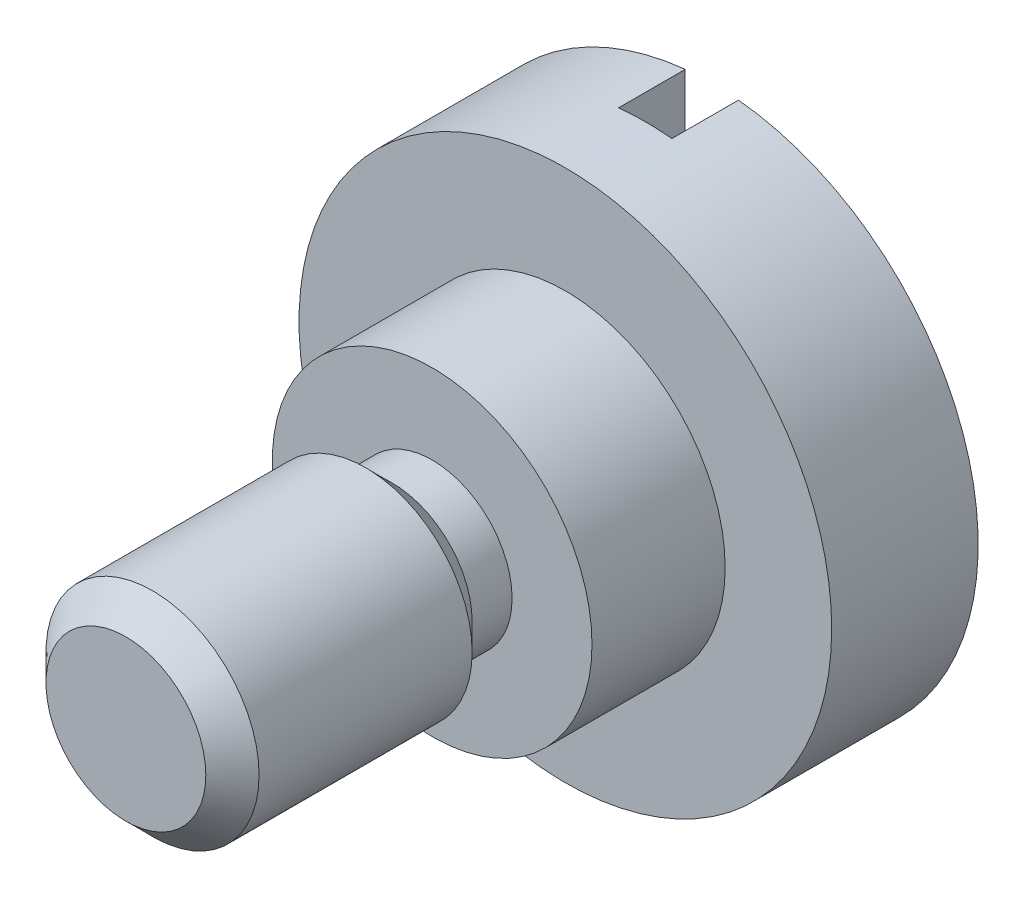
ISO-10303-21;
HEADER;
FILE_DESCRIPTION(('STEP AP214'),'2;1');
FILE_NAME('part.step','',(''),(''),'','','');
FILE_SCHEMA(('AUTOMOTIVE_DESIGN { 1 0 10303 214 1 1 1 1 }'));
ENDSEC;
DATA;
#1=APPLICATION_CONTEXT('core data for automotive mechanical design processes');
#2=APPLICATION_PROTOCOL_DEFINITION('international standard','automotive_design',2000,#1);
#3=PRODUCT_CONTEXT('',#1,'mechanical');
#4=PRODUCT('Part','Part','',(#3));
#5=PRODUCT_RELATED_PRODUCT_CATEGORY('part','',(#4));
#6=PRODUCT_DEFINITION_FORMATION('','',#4);
#7=PRODUCT_DEFINITION_CONTEXT('part definition',#1,'design');
#8=PRODUCT_DEFINITION('design','',#6,#7);
#9=PRODUCT_DEFINITION_SHAPE('','',#8);
#10=(LENGTH_UNIT() NAMED_UNIT(*) SI_UNIT(.MILLI.,.METRE.));
#11=(NAMED_UNIT(*) PLANE_ANGLE_UNIT() SI_UNIT($,.RADIAN.));
#12=(NAMED_UNIT(*) SI_UNIT($,.STERADIAN.) SOLID_ANGLE_UNIT());
#13=UNCERTAINTY_MEASURE_WITH_UNIT(LENGTH_MEASURE(1.E-05),#10,'distance_accuracy_value','');
#14=(GEOMETRIC_REPRESENTATION_CONTEXT(3) GLOBAL_UNCERTAINTY_ASSIGNED_CONTEXT((#13)) GLOBAL_UNIT_ASSIGNED_CONTEXT((#10,
#11,#12)) REPRESENTATION_CONTEXT('',''));
#15=CARTESIAN_POINT('',(0.,0.,0.));
#16=DIRECTION('',(0.,0.,1.));
#17=DIRECTION('',(1.,0.,0.));
#18=AXIS2_PLACEMENT_3D('',#15,#16,#17);
#19=CARTESIAN_POINT('',(0.,0.,0.));
#20=DIRECTION('',(0.,0.,1.));
#21=DIRECTION('',(1.,0.,0.));
#22=AXIS2_PLACEMENT_3D('',#19,#20,#21);
#23=PLANE('',#22);
#24=DIRECTION('',(0.,1.,0.));
#25=VECTOR('',#24,1.);
#26=CARTESIAN_POINT('',(-1.,0.,0.));
#27=LINE('',#26,#25);
#28=CARTESIAN_POINT('',(-1.,-9.9498743710662,0.));
#29=VERTEX_POINT('',#28);
#30=CARTESIAN_POINT('',(-1.,9.9498743710662,0.));
#31=VERTEX_POINT('',#30);
#32=EDGE_CURVE('E81',#29,#31,#27,.T.);
#33=ORIENTED_EDGE('',*,*,#32,.F.);
#34=CARTESIAN_POINT('',(0.,0.,0.));
#35=DIRECTION('',(0.,0.,1.));
#36=DIRECTION('',(1.,0.,0.));
#37=AXIS2_PLACEMENT_3D('',#34,#35,#36);
#38=CIRCLE('',#37,10.);
#39=EDGE_CURVE('E95',#31,#29,#38,.T.);
#40=ORIENTED_EDGE('',*,*,#39,.F.);
#41=EDGE_LOOP('',(#33,#40));
#42=FACE_BOUND('',#41,.T.);
#43=ADVANCED_FACE('F42',(#42),#23,.F.);
#44=CARTESIAN_POINT('',(0.,0.,5.5));
#45=DIRECTION('',(0.,0.,-1.));
#46=DIRECTION('',(-1.,0.,0.));
#47=AXIS2_PLACEMENT_3D('',#44,#45,#46);
#48=CYLINDRICAL_SURFACE('',#47,10.);
#49=CARTESIAN_POINT('',(1.,-9.9498743710662,0.));
#50=VERTEX_POINT('',#49);
#51=CARTESIAN_POINT('',(1.,9.9498743710662,0.));
#52=VERTEX_POINT('',#51);
#53=EDGE_CURVE('E100',#50,#52,#38,.T.);
#54=ORIENTED_EDGE('',*,*,#53,.T.);
#55=DIRECTION('',(0.,0.,-1.));
#56=VECTOR('',#55,1.);
#57=CARTESIAN_POINT('',(1.,9.9498743710662,5.5));
#58=LINE('',#57,#56);
#59=CARTESIAN_POINT('',(1.,9.9498743710662,2.5));
#60=VERTEX_POINT('',#59);
#61=EDGE_CURVE('E125',#52,#60,#58,.F.);
#62=ORIENTED_EDGE('',*,*,#61,.T.);
#63=CARTESIAN_POINT('',(0.,0.,2.5));
#64=DIRECTION('',(0.,0.,-1.));
#65=DIRECTION('',(-1.,0.,0.));
#66=AXIS2_PLACEMENT_3D('',#63,#64,#65);
#67=CIRCLE('',#66,10.);
#68=CARTESIAN_POINT('',(-1.,9.9498743710662,2.5));
#69=VERTEX_POINT('',#68);
#70=EDGE_CURVE('E12',#69,#60,#67,.T.);
#71=ORIENTED_EDGE('',*,*,#70,.F.);
#72=DIRECTION('',(0.,0.,-1.));
#73=VECTOR('',#72,1.);
#74=CARTESIAN_POINT('',(-1.,9.9498743710662,5.5));
#75=LINE('',#74,#73);
#76=EDGE_CURVE('E84',#31,#69,#75,.F.);
#77=ORIENTED_EDGE('',*,*,#76,.F.);
#78=ORIENTED_EDGE('',*,*,#39,.T.);
#79=DIRECTION('',(0.,0.,-1.));
#80=VECTOR('',#79,1.);
#81=CARTESIAN_POINT('',(-1.,-9.9498743710662,5.5));
#82=LINE('',#81,#80);
#83=CARTESIAN_POINT('',(-1.,-9.9498743710662,2.5));
#84=VERTEX_POINT('',#83);
#85=EDGE_CURVE('E58',#84,#29,#82,.T.);
#86=ORIENTED_EDGE('',*,*,#85,.F.);
#87=CARTESIAN_POINT('',(1.,-9.9498743710662,2.5));
#88=VERTEX_POINT('',#87);
#89=EDGE_CURVE('E47',#88,#84,#67,.T.);
#90=ORIENTED_EDGE('',*,*,#89,.F.);
#91=DIRECTION('',(0.,0.,-1.));
#92=VECTOR('',#91,1.);
#93=CARTESIAN_POINT('',(1.,-9.9498743710662,5.5));
#94=LINE('',#93,#92);
#95=EDGE_CURVE('E127',#88,#50,#94,.T.);
#96=ORIENTED_EDGE('',*,*,#95,.T.);
#97=EDGE_LOOP('',(#54,#62,#71,#77,#78,#86,#90,#96));
#98=FACE_BOUND('',#97,.T.);
#99=CARTESIAN_POINT('',(0.,0.,5.5));
#100=DIRECTION('',(0.,0.,1.));
#101=DIRECTION('',(1.,0.,0.));
#102=AXIS2_PLACEMENT_3D('',#99,#100,#101);
#103=CIRCLE('',#102,10.);
#104=CARTESIAN_POINT('',(10.,0.,5.5));
#105=VERTEX_POINT('',#104);
#106=EDGE_CURVE('E99',#105,#105,#103,.T.);
#107=ORIENTED_EDGE('',*,*,#106,.F.);
#108=EDGE_LOOP('',(#107));
#109=FACE_BOUND('',#108,.T.);
#110=ADVANCED_FACE('F93',(#98,#109),#48,.T.);
#111=CARTESIAN_POINT('',(0.,0.,5.5));
#112=DIRECTION('',(0.,0.,1.));
#113=DIRECTION('',(1.,0.,0.));
#114=AXIS2_PLACEMENT_3D('',#111,#112,#113);
#115=PLANE('',#114);
#116=CARTESIAN_POINT('',(0.,0.,5.5));
#117=DIRECTION('',(0.,0.,1.));
#118=DIRECTION('',(1.,0.,0.));
#119=AXIS2_PLACEMENT_3D('',#116,#117,#118);
#120=CIRCLE('',#119,6.);
#121=CARTESIAN_POINT('',(6.,0.,5.5));
#122=VERTEX_POINT('',#121);
#123=EDGE_CURVE('E103',#122,#122,#120,.T.);
#124=ORIENTED_EDGE('',*,*,#123,.F.);
#125=EDGE_LOOP('',(#124));
#126=FACE_BOUND('',#125,.T.);
#127=ORIENTED_EDGE('',*,*,#106,.T.);
#128=EDGE_LOOP('',(#127));
#129=FACE_BOUND('',#128,.T.);
#130=ADVANCED_FACE('F142',(#126,#129),#115,.T.);
#131=ORIENTED_EDGE('',*,*,#53,.F.);
#132=DIRECTION('',(0.,1.,0.));
#133=VECTOR('',#132,1.);
#134=CARTESIAN_POINT('',(1.,0.,0.));
#135=LINE('',#134,#133);
#136=EDGE_CURVE('E89',#50,#52,#135,.T.);
#137=ORIENTED_EDGE('',*,*,#136,.T.);
#138=EDGE_LOOP('',(#131,#137));
#139=FACE_BOUND('',#138,.T.);
#140=ADVANCED_FACE('F145',(#139),#23,.F.);
#141=CARTESIAN_POINT('',(0.,0.,10.5));
#142=DIRECTION('',(0.,0.,-1.));
#143=DIRECTION('',(-1.,0.,0.));
#144=AXIS2_PLACEMENT_3D('',#141,#142,#143);
#145=CYLINDRICAL_SURFACE('',#144,6.);
#146=CARTESIAN_POINT('',(0.,0.,10.5));
#147=DIRECTION('',(0.,0.,1.));
#148=DIRECTION('',(1.,0.,0.));
#149=AXIS2_PLACEMENT_3D('',#146,#147,#148);
#150=CIRCLE('',#149,6.);
#151=CARTESIAN_POINT('',(6.,0.,10.5));
#152=VERTEX_POINT('',#151);
#153=EDGE_CURVE('E105',#152,#152,#150,.T.);
#154=ORIENTED_EDGE('',*,*,#153,.F.);
#155=EDGE_LOOP('',(#154));
#156=FACE_BOUND('',#155,.T.);
#157=ORIENTED_EDGE('',*,*,#123,.T.);
#158=EDGE_LOOP('',(#157));
#159=FACE_BOUND('',#158,.T.);
#160=ADVANCED_FACE('F140',(#156,#159),#145,.T.);
#161=CARTESIAN_POINT('',(0.,0.,10.5));
#162=DIRECTION('',(0.,0.,1.));
#163=DIRECTION('',(1.,0.,0.));
#164=AXIS2_PLACEMENT_3D('',#161,#162,#163);
#165=PLANE('',#164);
#166=CARTESIAN_POINT('',(0.,0.,10.5));
#167=DIRECTION('',(0.,0.,1.));
#168=DIRECTION('',(1.,0.,0.));
#169=AXIS2_PLACEMENT_3D('',#166,#167,#168);
#170=CIRCLE('',#169,3.);
#171=CARTESIAN_POINT('',(3.,0.,10.5));
#172=VERTEX_POINT('',#171);
#173=EDGE_CURVE('E112',#172,#172,#170,.T.);
#174=ORIENTED_EDGE('',*,*,#173,.F.);
#175=EDGE_LOOP('',(#174));
#176=FACE_BOUND('',#175,.T.);
#177=ORIENTED_EDGE('',*,*,#153,.T.);
#178=EDGE_LOOP('',(#177));
#179=FACE_BOUND('',#178,.T.);
#180=ADVANCED_FACE('F184',(#176,#179),#165,.T.);
#181=CARTESIAN_POINT('',(0.,0.,12.));
#182=DIRECTION('',(0.,0.,-1.));
#183=DIRECTION('',(-1.,0.,0.));
#184=AXIS2_PLACEMENT_3D('',#181,#182,#183);
#185=CYLINDRICAL_SURFACE('',#184,3.);
#186=CARTESIAN_POINT('',(0.,0.,12.));
#187=DIRECTION('',(0.,0.,1.));
#188=DIRECTION('',(1.,0.,0.));
#189=AXIS2_PLACEMENT_3D('',#186,#187,#188);
#190=CIRCLE('',#189,3.);
#191=CARTESIAN_POINT('',(3.,0.,12.));
#192=VERTEX_POINT('',#191);
#193=EDGE_CURVE('E131',#192,#192,#190,.T.);
#194=ORIENTED_EDGE('',*,*,#193,.F.);
#195=EDGE_LOOP('',(#194));
#196=FACE_BOUND('',#195,.T.);
#197=ORIENTED_EDGE('',*,*,#173,.T.);
#198=EDGE_LOOP('',(#197));
#199=FACE_BOUND('',#198,.T.);
#200=ADVANCED_FACE('F176',(#196,#199),#185,.T.);
#201=CARTESIAN_POINT('',(0.,0.,22.));
#202=DIRECTION('',(0.,0.,-1.));
#203=DIRECTION('',(-1.,0.,0.));
#204=AXIS2_PLACEMENT_3D('',#201,#202,#203);
#205=CYLINDRICAL_SURFACE('',#204,4.);
#206=CARTESIAN_POINT('',(0.,0.,13.));
#207=DIRECTION('',(0.,0.,1.));
#208=DIRECTION('',(1.,0.,0.));
#209=AXIS2_PLACEMENT_3D('',#206,#207,#208);
#210=CIRCLE('',#209,4.);
#211=CARTESIAN_POINT('',(4.,0.,13.));
#212=VERTEX_POINT('',#211);
#213=EDGE_CURVE('E111',#212,#212,#210,.T.);
#214=ORIENTED_EDGE('',*,*,#213,.T.);
#215=EDGE_LOOP('',(#214));
#216=FACE_BOUND('',#215,.T.);
#217=CARTESIAN_POINT('',(0.,0.,21.));
#218=DIRECTION('',(0.,0.,1.));
#219=DIRECTION('',(1.,0.,0.));
#220=AXIS2_PLACEMENT_3D('',#217,#218,#219);
#221=CIRCLE('',#220,4.);
#222=CARTESIAN_POINT('',(4.,0.,21.));
#223=VERTEX_POINT('',#222);
#224=EDGE_CURVE('E108',#223,#223,#221,.F.);
#225=ORIENTED_EDGE('',*,*,#224,.T.);
#226=EDGE_LOOP('',(#225));
#227=FACE_BOUND('',#226,.T.);
#228=ADVANCED_FACE('F167',(#216,#227),#205,.T.);
#229=CARTESIAN_POINT('',(0.,0.,22.));
#230=DIRECTION('',(0.,0.,1.));
#231=DIRECTION('',(1.,0.,0.));
#232=AXIS2_PLACEMENT_3D('',#229,#230,#231);
#233=PLANE('',#232);
#234=CARTESIAN_POINT('',(0.,0.,22.));
#235=DIRECTION('',(0.,0.,1.));
#236=DIRECTION('',(1.,0.,0.));
#237=AXIS2_PLACEMENT_3D('',#234,#235,#236);
#238=CIRCLE('',#237,3.00000000000001);
#239=CARTESIAN_POINT('',(3.00000000000001,0.,22.));
#240=VERTEX_POINT('',#239);
#241=EDGE_CURVE('E90',#240,#240,#238,.T.);
#242=ORIENTED_EDGE('',*,*,#241,.T.);
#243=EDGE_LOOP('',(#242));
#244=FACE_BOUND('',#243,.T.);
#245=ADVANCED_FACE('F160',(#244),#233,.T.);
#246=CARTESIAN_POINT('',(0.,0.,13.));
#247=DIRECTION('',(0.,0.,1.));
#248=DIRECTION('',(1.,0.,0.));
#249=AXIS2_PLACEMENT_3D('',#246,#247,#248);
#250=CONICAL_SURFACE('',#249,4.,0.78539816339745);
#251=ORIENTED_EDGE('',*,*,#193,.T.);
#252=EDGE_LOOP('',(#251));
#253=FACE_BOUND('',#252,.T.);
#254=ORIENTED_EDGE('',*,*,#213,.F.);
#255=EDGE_LOOP('',(#254));
#256=FACE_BOUND('',#255,.T.);
#257=ADVANCED_FACE('F156',(#253,#256),#250,.T.);
#258=CARTESIAN_POINT('',(0.,0.,22.));
#259=DIRECTION('',(0.,0.,-1.));
#260=DIRECTION('',(-1.,0.,0.));
#261=AXIS2_PLACEMENT_3D('',#258,#259,#260);
#262=CONICAL_SURFACE('',#261,3.00000000000001,0.785398163397447);
#263=ORIENTED_EDGE('',*,*,#224,.F.);
#264=EDGE_LOOP('',(#263));
#265=FACE_BOUND('',#264,.T.);
#266=ORIENTED_EDGE('',*,*,#241,.F.);
#267=EDGE_LOOP('',(#266));
#268=FACE_BOUND('',#267,.T.);
#269=ADVANCED_FACE('F45',(#265,#268),#262,.T.);
#270=CARTESIAN_POINT('',(0.,0.,2.5));
#271=DIRECTION('',(0.,0.,-1.));
#272=DIRECTION('',(-1.,0.,0.));
#273=AXIS2_PLACEMENT_3D('',#270,#271,#272);
#274=PLANE('',#273);
#275=DIRECTION('',(0.,1.,0.));
#276=VECTOR('',#275,1.);
#277=CARTESIAN_POINT('',(-1.,10.,2.5));
#278=LINE('',#277,#276);
#279=EDGE_CURVE('E97',#69,#84,#278,.F.);
#280=ORIENTED_EDGE('',*,*,#279,.F.);
#281=ORIENTED_EDGE('',*,*,#70,.T.);
#282=DIRECTION('',(0.,1.,0.));
#283=VECTOR('',#282,1.);
#284=CARTESIAN_POINT('',(1.,10.,2.5));
#285=LINE('',#284,#283);
#286=EDGE_CURVE('E123',#60,#88,#285,.F.);
#287=ORIENTED_EDGE('',*,*,#286,.T.);
#288=ORIENTED_EDGE('',*,*,#89,.T.);
#289=EDGE_LOOP('',(#280,#281,#287,#288));
#290=FACE_BOUND('',#289,.T.);
#291=ADVANCED_FACE('F121',(#290),#274,.T.);
#292=CARTESIAN_POINT('',(1.,10.,2.5));
#293=DIRECTION('',(1.,0.,0.));
#294=DIRECTION('',(0.,0.,-1.));
#295=AXIS2_PLACEMENT_3D('',#292,#293,#294);
#296=PLANE('',#295);
#297=ORIENTED_EDGE('',*,*,#286,.F.);
#298=ORIENTED_EDGE('',*,*,#61,.F.);
#299=ORIENTED_EDGE('',*,*,#136,.F.);
#300=ORIENTED_EDGE('',*,*,#95,.F.);
#301=EDGE_LOOP('',(#297,#298,#299,#300));
#302=FACE_BOUND('',#301,.T.);
#303=ADVANCED_FACE('F202',(#302),#296,.F.);
#304=CARTESIAN_POINT('',(-1.,10.,2.5));
#305=DIRECTION('',(1.,0.,0.));
#306=DIRECTION('',(0.,0.,-1.));
#307=AXIS2_PLACEMENT_3D('',#304,#305,#306);
#308=PLANE('',#307);
#309=ORIENTED_EDGE('',*,*,#85,.T.);
#310=ORIENTED_EDGE('',*,*,#32,.T.);
#311=ORIENTED_EDGE('',*,*,#76,.T.);
#312=ORIENTED_EDGE('',*,*,#279,.T.);
#313=EDGE_LOOP('',(#309,#310,#311,#312));
#314=FACE_BOUND('',#313,.T.);
#315=ADVANCED_FACE('F83',(#314),#308,.T.);
#316=CLOSED_SHELL('',(#43,#110,#130,#140,#160,#180,#200,#228,#245,#257,#269,#291,#303,#315));
#317=MANIFOLD_SOLID_BREP('B2',#316);
#318=ADVANCED_BREP_SHAPE_REPRESENTATION('',(#18,#317),#14);
#319=SHAPE_DEFINITION_REPRESENTATION(#9,#318);
ENDSEC;
END-ISO-10303-21;
